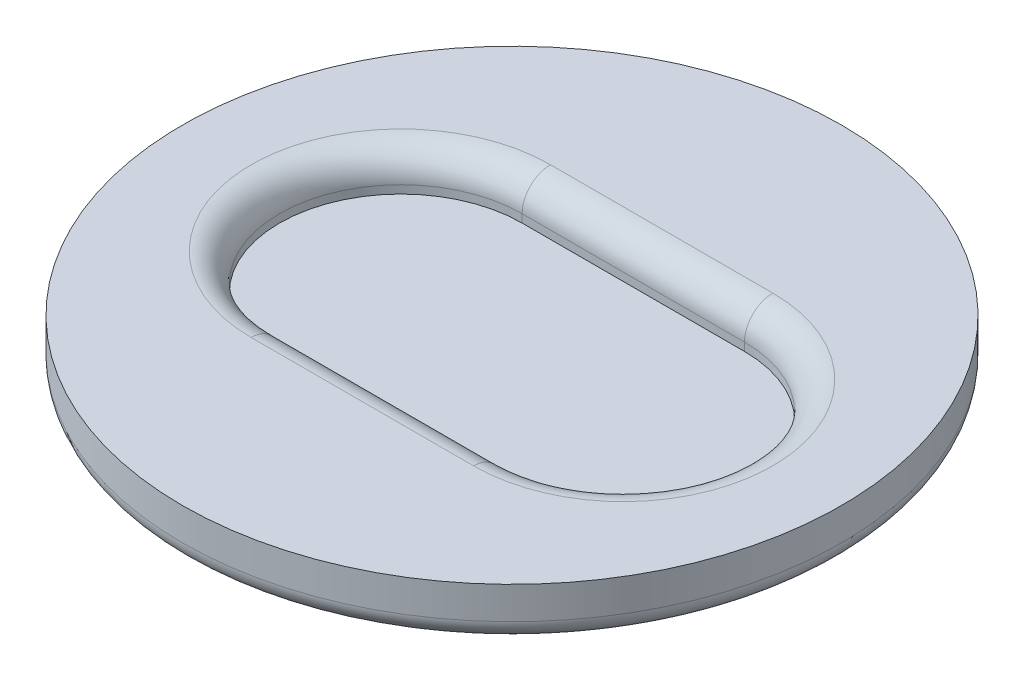
ISO-10303-21;
HEADER;
FILE_DESCRIPTION(('STEP AP214'),'2;1');
FILE_NAME('part.step','',(''),(''),'','','');
FILE_SCHEMA(('AUTOMOTIVE_DESIGN { 1 0 10303 214 1 1 1 1 }'));
ENDSEC;
DATA;
#1=APPLICATION_CONTEXT('core data for automotive mechanical design processes');
#2=APPLICATION_PROTOCOL_DEFINITION('international standard','automotive_design',2000,#1);
#3=PRODUCT_CONTEXT('',#1,'mechanical');
#4=PRODUCT('Part','Part','',(#3));
#5=PRODUCT_RELATED_PRODUCT_CATEGORY('part','',(#4));
#6=PRODUCT_DEFINITION_FORMATION('','',#4);
#7=PRODUCT_DEFINITION_CONTEXT('part definition',#1,'design');
#8=PRODUCT_DEFINITION('design','',#6,#7);
#9=PRODUCT_DEFINITION_SHAPE('','',#8);
#10=(LENGTH_UNIT() NAMED_UNIT(*) SI_UNIT(.MILLI.,.METRE.));
#11=(NAMED_UNIT(*) PLANE_ANGLE_UNIT() SI_UNIT($,.RADIAN.));
#12=(NAMED_UNIT(*) SI_UNIT($,.STERADIAN.) SOLID_ANGLE_UNIT());
#13=UNCERTAINTY_MEASURE_WITH_UNIT(LENGTH_MEASURE(1.E-05),#10,'distance_accuracy_value','');
#14=(GEOMETRIC_REPRESENTATION_CONTEXT(3) GLOBAL_UNCERTAINTY_ASSIGNED_CONTEXT((#13)) GLOBAL_UNIT_ASSIGNED_CONTEXT((#10,
#11,#12)) REPRESENTATION_CONTEXT('',''));
#15=CARTESIAN_POINT('',(0.,0.,0.));
#16=DIRECTION('',(0.,0.,1.));
#17=DIRECTION('',(1.,0.,0.));
#18=AXIS2_PLACEMENT_3D('',#15,#16,#17);
#19=CARTESIAN_POINT('',(2.75,1.3,0.));
#20=DIRECTION('',(0.,-1.,0.));
#21=DIRECTION('',(0.,0.,-1.));
#22=AXIS2_PLACEMENT_3D('',#19,#20,#21);
#23=CYLINDRICAL_SURFACE('',#22,3.);
#24=DIRECTION('',(0.,-1.,0.));
#25=VECTOR('',#24,1.);
#26=CARTESIAN_POINT('',(2.75,1.3,3.));
#27=LINE('',#26,#25);
#28=CARTESIAN_POINT('',(2.75,0.6,3.));
#29=VERTEX_POINT('',#28);
#30=CARTESIAN_POINT('',(2.75,0.4,3.));
#31=VERTEX_POINT('',#30);
#32=EDGE_CURVE('E94',#29,#31,#27,.T.);
#33=ORIENTED_EDGE('',*,*,#32,.F.);
#34=CARTESIAN_POINT('',(2.75,0.6,0.));
#35=DIRECTION('',(0.,1.,0.));
#36=DIRECTION('',(0.,0.,1.));
#37=AXIS2_PLACEMENT_3D('',#34,#35,#36);
#38=CIRCLE('',#37,3.);
#39=CARTESIAN_POINT('',(2.75,0.6,-3.));
#40=VERTEX_POINT('',#39);
#41=EDGE_CURVE('E105',#29,#40,#38,.T.);
#42=ORIENTED_EDGE('',*,*,#41,.T.);
#43=DIRECTION('',(0.,-1.,0.));
#44=VECTOR('',#43,1.);
#45=CARTESIAN_POINT('',(2.75,1.3,-3.));
#46=LINE('',#45,#44);
#47=CARTESIAN_POINT('',(2.75,0.4,-3.));
#48=VERTEX_POINT('',#47);
#49=EDGE_CURVE('E120',#40,#48,#46,.T.);
#50=ORIENTED_EDGE('',*,*,#49,.T.);
#51=CARTESIAN_POINT('',(2.75,0.4,0.));
#52=DIRECTION('',(0.,1.,0.));
#53=DIRECTION('',(0.,0.,1.));
#54=AXIS2_PLACEMENT_3D('',#51,#52,#53);
#55=CIRCLE('',#54,3.);
#56=EDGE_CURVE('E113',#31,#48,#55,.T.);
#57=ORIENTED_EDGE('',*,*,#56,.F.);
#58=EDGE_LOOP('',(#33,#42,#50,#57));
#59=FACE_BOUND('',#58,.T.);
#60=ADVANCED_FACE('F39',(#59),#23,.F.);
#61=CARTESIAN_POINT('',(0.,1.3,3.));
#62=DIRECTION('',(0.,0.,-1.));
#63=DIRECTION('',(-1.,0.,0.));
#64=AXIS2_PLACEMENT_3D('',#61,#62,#63);
#65=PLANE('',#64);
#66=DIRECTION('',(0.,-1.,0.));
#67=VECTOR('',#66,1.);
#68=CARTESIAN_POINT('',(-2.75,1.3,3.));
#69=LINE('',#68,#67);
#70=CARTESIAN_POINT('',(-2.75,0.6,3.));
#71=VERTEX_POINT('',#70);
#72=CARTESIAN_POINT('',(-2.75,0.4,3.));
#73=VERTEX_POINT('',#72);
#74=EDGE_CURVE('E106',#71,#73,#69,.T.);
#75=ORIENTED_EDGE('',*,*,#74,.F.);
#76=DIRECTION('',(1.,0.,0.));
#77=VECTOR('',#76,1.);
#78=CARTESIAN_POINT('',(0.,0.6,3.));
#79=LINE('',#78,#77);
#80=EDGE_CURVE('E99',#71,#29,#79,.T.);
#81=ORIENTED_EDGE('',*,*,#80,.T.);
#82=ORIENTED_EDGE('',*,*,#32,.T.);
#83=DIRECTION('',(1.,0.,0.));
#84=VECTOR('',#83,1.);
#85=CARTESIAN_POINT('',(0.,0.4,3.));
#86=LINE('',#85,#84);
#87=EDGE_CURVE('E97',#73,#31,#86,.T.);
#88=ORIENTED_EDGE('',*,*,#87,.F.);
#89=EDGE_LOOP('',(#75,#81,#82,#88));
#90=FACE_BOUND('',#89,.T.);
#91=ADVANCED_FACE('F96',(#90),#65,.T.);
#92=CARTESIAN_POINT('',(-2.75,1.3,0.));
#93=DIRECTION('',(0.,-1.,0.));
#94=DIRECTION('',(0.,0.,-1.));
#95=AXIS2_PLACEMENT_3D('',#92,#93,#94);
#96=CYLINDRICAL_SURFACE('',#95,3.);
#97=DIRECTION('',(0.,-1.,0.));
#98=VECTOR('',#97,1.);
#99=CARTESIAN_POINT('',(-2.75,1.3,-3.));
#100=LINE('',#99,#98);
#101=CARTESIAN_POINT('',(-2.75,0.6,-3.));
#102=VERTEX_POINT('',#101);
#103=CARTESIAN_POINT('',(-2.75,0.4,-3.));
#104=VERTEX_POINT('',#103);
#105=EDGE_CURVE('E135',#102,#104,#100,.T.);
#106=ORIENTED_EDGE('',*,*,#105,.F.);
#107=CARTESIAN_POINT('',(-2.75,0.6,0.));
#108=DIRECTION('',(0.,1.,0.));
#109=DIRECTION('',(0.,0.,1.));
#110=AXIS2_PLACEMENT_3D('',#107,#108,#109);
#111=CIRCLE('',#110,3.);
#112=EDGE_CURVE('E62',#102,#71,#111,.T.);
#113=ORIENTED_EDGE('',*,*,#112,.T.);
#114=ORIENTED_EDGE('',*,*,#74,.T.);
#115=CARTESIAN_POINT('',(-2.75,0.4,0.));
#116=DIRECTION('',(0.,1.,0.));
#117=DIRECTION('',(0.,0.,1.));
#118=AXIS2_PLACEMENT_3D('',#115,#116,#117);
#119=CIRCLE('',#118,3.);
#120=EDGE_CURVE('E116',#104,#73,#119,.T.);
#121=ORIENTED_EDGE('',*,*,#120,.F.);
#122=EDGE_LOOP('',(#106,#113,#114,#121));
#123=FACE_BOUND('',#122,.T.);
#124=ADVANCED_FACE('F195',(#123),#96,.F.);
#125=CARTESIAN_POINT('',(0.,1.3,-3.));
#126=DIRECTION('',(0.,0.,-1.));
#127=DIRECTION('',(-1.,0.,0.));
#128=AXIS2_PLACEMENT_3D('',#125,#126,#127);
#129=PLANE('',#128);
#130=ORIENTED_EDGE('',*,*,#49,.F.);
#131=DIRECTION('',(1.,0.,0.));
#132=VECTOR('',#131,1.);
#133=CARTESIAN_POINT('',(-2.75,0.6,-3.));
#134=LINE('',#133,#132);
#135=EDGE_CURVE('E55',#40,#102,#134,.F.);
#136=ORIENTED_EDGE('',*,*,#135,.T.);
#137=ORIENTED_EDGE('',*,*,#105,.T.);
#138=DIRECTION('',(1.,0.,0.));
#139=VECTOR('',#138,1.);
#140=CARTESIAN_POINT('',(0.,0.4,-3.));
#141=LINE('',#140,#139);
#142=EDGE_CURVE('E122',#104,#48,#141,.T.);
#143=ORIENTED_EDGE('',*,*,#142,.T.);
#144=EDGE_LOOP('',(#130,#136,#137,#143));
#145=FACE_BOUND('',#144,.T.);
#146=ADVANCED_FACE('F224',(#145),#129,.F.);
#147=CARTESIAN_POINT('',(0.,1.3,0.));
#148=DIRECTION('',(0.,-1.,0.));
#149=DIRECTION('',(0.,0.,-1.));
#150=AXIS2_PLACEMENT_3D('',#147,#148,#149);
#151=CYLINDRICAL_SURFACE('',#150,8.15);
#152=CARTESIAN_POINT('',(0.,0.5,0.));
#153=DIRECTION('',(0.,1.,0.));
#154=DIRECTION('',(0.,0.,1.));
#155=AXIS2_PLACEMENT_3D('',#152,#153,#154);
#156=CIRCLE('',#155,8.15);
#157=CARTESIAN_POINT('',(0.,0.5,8.15));
#158=VERTEX_POINT('',#157);
#159=EDGE_CURVE('E48',#158,#158,#156,.T.);
#160=ORIENTED_EDGE('',*,*,#159,.T.);
#161=EDGE_LOOP('',(#160));
#162=FACE_BOUND('',#161,.T.);
#163=CARTESIAN_POINT('',(0.,1.3,0.));
#164=DIRECTION('',(0.,1.,0.));
#165=DIRECTION('',(0.,0.,1.));
#166=AXIS2_PLACEMENT_3D('',#163,#164,#165);
#167=CIRCLE('',#166,8.15);
#168=CARTESIAN_POINT('',(0.,1.3,8.15));
#169=VERTEX_POINT('',#168);
#170=EDGE_CURVE('E129',#169,#169,#167,.T.);
#171=ORIENTED_EDGE('',*,*,#170,.F.);
#172=EDGE_LOOP('',(#171));
#173=FACE_BOUND('',#172,.T.);
#174=ADVANCED_FACE('F177',(#162,#173),#151,.T.);
#175=CARTESIAN_POINT('',(0.,1.3,0.));
#176=DIRECTION('',(0.,1.,0.));
#177=DIRECTION('',(0.,0.,1.));
#178=AXIS2_PLACEMENT_3D('',#175,#176,#177);
#179=PLANE('',#178);
#180=DIRECTION('',(1.,0.,0.));
#181=VECTOR('',#180,1.);
#182=CARTESIAN_POINT('',(2.75,1.3,-3.7));
#183=LINE('',#182,#181);
#184=CARTESIAN_POINT('',(-2.75,1.3,-3.7));
#185=VERTEX_POINT('',#184);
#186=CARTESIAN_POINT('',(2.75,1.3,-3.7));
#187=VERTEX_POINT('',#186);
#188=EDGE_CURVE('E142',#185,#187,#183,.T.);
#189=ORIENTED_EDGE('',*,*,#188,.T.);
#190=CARTESIAN_POINT('',(2.75,1.3,0.));
#191=DIRECTION('',(0.,1.,0.));
#192=DIRECTION('',(0.,0.,1.));
#193=AXIS2_PLACEMENT_3D('',#190,#191,#192);
#194=CIRCLE('',#193,3.7);
#195=CARTESIAN_POINT('',(2.75,1.3,3.7));
#196=VERTEX_POINT('',#195);
#197=EDGE_CURVE('E151',#187,#196,#194,.F.);
#198=ORIENTED_EDGE('',*,*,#197,.T.);
#199=DIRECTION('',(1.,0.,0.));
#200=VECTOR('',#199,1.);
#201=CARTESIAN_POINT('',(0.,1.3,3.7));
#202=LINE('',#201,#200);
#203=CARTESIAN_POINT('',(-2.75,1.3,3.7));
#204=VERTEX_POINT('',#203);
#205=EDGE_CURVE('E148',#196,#204,#202,.F.);
#206=ORIENTED_EDGE('',*,*,#205,.T.);
#207=CARTESIAN_POINT('',(-2.75,1.3,0.));
#208=DIRECTION('',(0.,1.,0.));
#209=DIRECTION('',(0.,0.,1.));
#210=AXIS2_PLACEMENT_3D('',#207,#208,#209);
#211=CIRCLE('',#210,3.7);
#212=EDGE_CURVE('E145',#204,#185,#211,.F.);
#213=ORIENTED_EDGE('',*,*,#212,.T.);
#214=EDGE_LOOP('',(#189,#198,#206,#213));
#215=FACE_BOUND('',#214,.T.);
#216=ORIENTED_EDGE('',*,*,#170,.T.);
#217=EDGE_LOOP('',(#216));
#218=FACE_BOUND('',#217,.T.);
#219=ADVANCED_FACE('F220',(#215,#218),#179,.T.);
#220=CARTESIAN_POINT('',(0.,0.,0.));
#221=DIRECTION('',(0.,1.,0.));
#222=DIRECTION('',(0.,0.,1.));
#223=AXIS2_PLACEMENT_3D('',#220,#221,#222);
#224=PLANE('',#223);
#225=CARTESIAN_POINT('',(0.,0.,0.));
#226=DIRECTION('',(0.,1.,0.));
#227=DIRECTION('',(0.,0.,1.));
#228=AXIS2_PLACEMENT_3D('',#225,#226,#227);
#229=CIRCLE('',#228,7.65);
#230=CARTESIAN_POINT('',(0.,0.,7.65));
#231=VERTEX_POINT('',#230);
#232=EDGE_CURVE('E11',#231,#231,#229,.F.);
#233=ORIENTED_EDGE('',*,*,#232,.T.);
#234=EDGE_LOOP('',(#233));
#235=FACE_BOUND('',#234,.T.);
#236=ADVANCED_FACE('F211',(#235),#224,.F.);
#237=CARTESIAN_POINT('',(0.,0.4,0.));
#238=DIRECTION('',(0.,1.,0.));
#239=DIRECTION('',(0.,0.,1.));
#240=AXIS2_PLACEMENT_3D('',#237,#238,#239);
#241=PLANE('',#240);
#242=ORIENTED_EDGE('',*,*,#87,.T.);
#243=ORIENTED_EDGE('',*,*,#56,.T.);
#244=ORIENTED_EDGE('',*,*,#142,.F.);
#245=ORIENTED_EDGE('',*,*,#120,.T.);
#246=EDGE_LOOP('',(#242,#243,#244,#245));
#247=FACE_BOUND('',#246,.T.);
#248=ADVANCED_FACE('F111',(#247),#241,.T.);
#249=CARTESIAN_POINT('',(-2.75,0.6,0.));
#250=DIRECTION('',(0.,1.,0.));
#251=DIRECTION('',(0.,0.,1.));
#252=AXIS2_PLACEMENT_3D('',#249,#250,#251);
#253=TOROIDAL_SURFACE('',#252,3.7,0.7);
#254=CARTESIAN_POINT('',(-2.75,0.6,-3.7));
#255=DIRECTION('',(1.,0.,0.));
#256=DIRECTION('',(0.,0.,-1.));
#257=AXIS2_PLACEMENT_3D('',#254,#255,#256);
#258=CIRCLE('',#257,0.7);
#259=EDGE_CURVE('E167',#185,#102,#258,.T.);
#260=ORIENTED_EDGE('',*,*,#259,.F.);
#261=ORIENTED_EDGE('',*,*,#212,.F.);
#262=CARTESIAN_POINT('',(-2.75,0.6,3.7));
#263=DIRECTION('',(1.,0.,0.));
#264=DIRECTION('',(0.,0.,-1.));
#265=AXIS2_PLACEMENT_3D('',#262,#263,#264);
#266=CIRCLE('',#265,0.7);
#267=EDGE_CURVE('E118',#71,#204,#266,.T.);
#268=ORIENTED_EDGE('',*,*,#267,.F.);
#269=ORIENTED_EDGE('',*,*,#112,.F.);
#270=EDGE_LOOP('',(#260,#261,#268,#269));
#271=FACE_BOUND('',#270,.T.);
#272=ADVANCED_FACE('F204',(#271),#253,.T.);
#273=CARTESIAN_POINT('',(0.,0.6,3.7));
#274=DIRECTION('',(1.,0.,0.));
#275=DIRECTION('',(0.,0.,-1.));
#276=AXIS2_PLACEMENT_3D('',#273,#274,#275);
#277=CYLINDRICAL_SURFACE('',#276,0.7);
#278=ORIENTED_EDGE('',*,*,#267,.T.);
#279=ORIENTED_EDGE('',*,*,#205,.F.);
#280=CARTESIAN_POINT('',(2.75,0.6,3.7));
#281=DIRECTION('',(1.,0.,0.));
#282=DIRECTION('',(0.,0.,-1.));
#283=AXIS2_PLACEMENT_3D('',#280,#281,#282);
#284=CIRCLE('',#283,0.7);
#285=EDGE_CURVE('E164',#29,#196,#284,.T.);
#286=ORIENTED_EDGE('',*,*,#285,.F.);
#287=ORIENTED_EDGE('',*,*,#80,.F.);
#288=EDGE_LOOP('',(#278,#279,#286,#287));
#289=FACE_BOUND('',#288,.T.);
#290=ADVANCED_FACE('F201',(#289),#277,.T.);
#291=CARTESIAN_POINT('',(0.,0.6,-3.7));
#292=DIRECTION('',(-1.,0.,0.));
#293=DIRECTION('',(0.,0.,1.));
#294=AXIS2_PLACEMENT_3D('',#291,#292,#293);
#295=CYLINDRICAL_SURFACE('',#294,0.7);
#296=ORIENTED_EDGE('',*,*,#259,.T.);
#297=ORIENTED_EDGE('',*,*,#135,.F.);
#298=CARTESIAN_POINT('',(2.75,0.6,-3.7));
#299=DIRECTION('',(1.,0.,0.));
#300=DIRECTION('',(0.,0.,-1.));
#301=AXIS2_PLACEMENT_3D('',#298,#299,#300);
#302=CIRCLE('',#301,0.7);
#303=EDGE_CURVE('E161',#187,#40,#302,.T.);
#304=ORIENTED_EDGE('',*,*,#303,.F.);
#305=ORIENTED_EDGE('',*,*,#188,.F.);
#306=EDGE_LOOP('',(#296,#297,#304,#305));
#307=FACE_BOUND('',#306,.T.);
#308=ADVANCED_FACE('F186',(#307),#295,.T.);
#309=CARTESIAN_POINT('',(2.75,0.6,0.));
#310=DIRECTION('',(0.,1.,0.));
#311=DIRECTION('',(0.,0.,1.));
#312=AXIS2_PLACEMENT_3D('',#309,#310,#311);
#313=TOROIDAL_SURFACE('',#312,3.7,0.7);
#314=ORIENTED_EDGE('',*,*,#285,.T.);
#315=ORIENTED_EDGE('',*,*,#197,.F.);
#316=ORIENTED_EDGE('',*,*,#303,.T.);
#317=ORIENTED_EDGE('',*,*,#41,.F.);
#318=EDGE_LOOP('',(#314,#315,#316,#317));
#319=FACE_BOUND('',#318,.T.);
#320=ADVANCED_FACE('F181',(#319),#313,.T.);
#321=CARTESIAN_POINT('',(0.,0.5,0.));
#322=DIRECTION('',(0.,1.,0.));
#323=DIRECTION('',(0.,0.,1.));
#324=AXIS2_PLACEMENT_3D('',#321,#322,#323);
#325=TOROIDAL_SURFACE('',#324,7.65,0.5);
#326=ORIENTED_EDGE('',*,*,#232,.F.);
#327=EDGE_LOOP('',(#326));
#328=FACE_BOUND('',#327,.T.);
#329=ORIENTED_EDGE('',*,*,#159,.F.);
#330=EDGE_LOOP('',(#329));
#331=FACE_BOUND('',#330,.T.);
#332=ADVANCED_FACE('F41',(#328,#331),#325,.T.);
#333=CLOSED_SHELL('',(#60,#91,#124,#146,#174,#219,#236,#248,#272,#290,#308,#320,#332));
#334=MANIFOLD_SOLID_BREP('B2',#333);
#335=ADVANCED_BREP_SHAPE_REPRESENTATION('',(#18,#334),#14);
#336=SHAPE_DEFINITION_REPRESENTATION(#9,#335);
ENDSEC;
END-ISO-10303-21;
